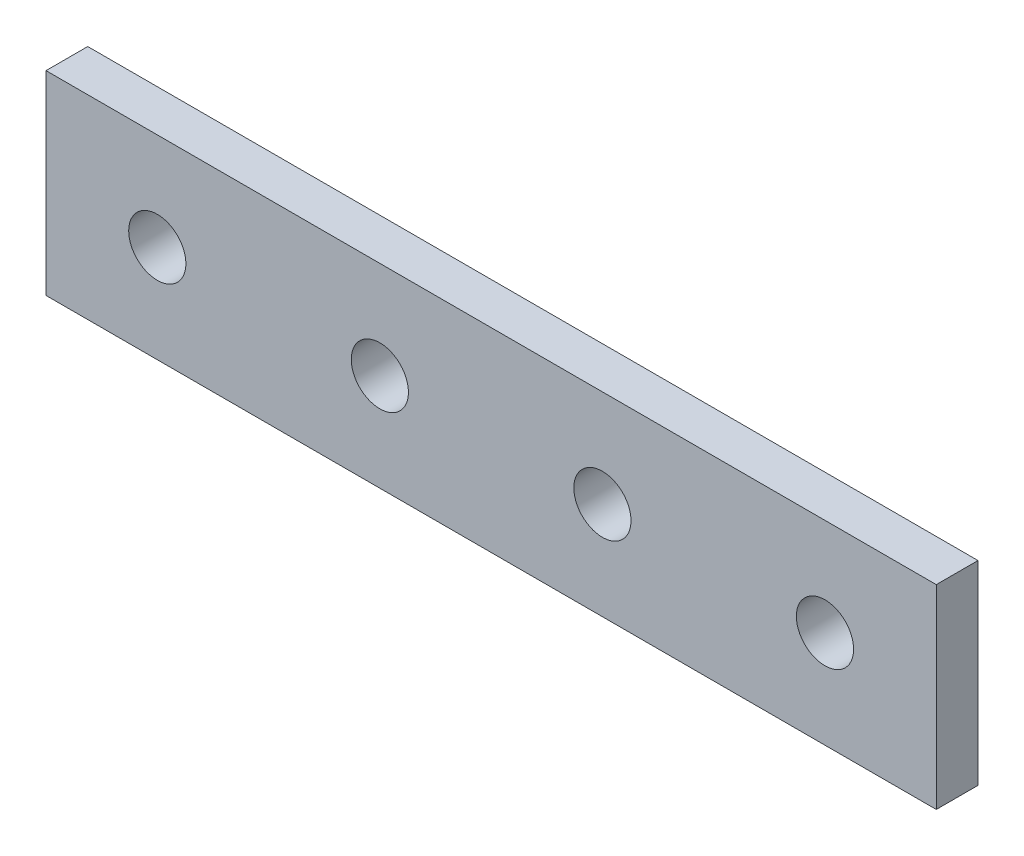
ISO-10303-21;
HEADER;
FILE_DESCRIPTION(('STEP AP214'),'2;1');
FILE_NAME('part.step','',(''),(''),'','','');
FILE_SCHEMA(('AUTOMOTIVE_DESIGN { 1 0 10303 214 1 1 1 1 }'));
ENDSEC;
DATA;
#1=APPLICATION_CONTEXT('core data for automotive mechanical design processes');
#2=APPLICATION_PROTOCOL_DEFINITION('international standard','automotive_design',2000,#1);
#3=PRODUCT_CONTEXT('',#1,'mechanical');
#4=PRODUCT('Part','Part','',(#3));
#5=PRODUCT_RELATED_PRODUCT_CATEGORY('part','',(#4));
#6=PRODUCT_DEFINITION_FORMATION('','',#4);
#7=PRODUCT_DEFINITION_CONTEXT('part definition',#1,'design');
#8=PRODUCT_DEFINITION('design','',#6,#7);
#9=PRODUCT_DEFINITION_SHAPE('','',#8);
#10=(LENGTH_UNIT() NAMED_UNIT(*) SI_UNIT(.MILLI.,.METRE.));
#11=(NAMED_UNIT(*) PLANE_ANGLE_UNIT() SI_UNIT($,.RADIAN.));
#12=(NAMED_UNIT(*) SI_UNIT($,.STERADIAN.) SOLID_ANGLE_UNIT());
#13=UNCERTAINTY_MEASURE_WITH_UNIT(LENGTH_MEASURE(1.E-05),#10,'distance_accuracy_value','');
#14=(GEOMETRIC_REPRESENTATION_CONTEXT(3) GLOBAL_UNCERTAINTY_ASSIGNED_CONTEXT((#13)) GLOBAL_UNIT_ASSIGNED_CONTEXT((#10,
#11,#12)) REPRESENTATION_CONTEXT('',''));
#15=CARTESIAN_POINT('',(0.,0.,0.));
#16=DIRECTION('',(0.,0.,1.));
#17=DIRECTION('',(1.,0.,0.));
#18=AXIS2_PLACEMENT_3D('',#15,#16,#17);
#19=CARTESIAN_POINT('',(0.,0.,2.38125));
#20=DIRECTION('',(0.,0.,-1.));
#21=DIRECTION('',(-1.,0.,0.));
#22=AXIS2_PLACEMENT_3D('',#19,#20,#21);
#23=PLANE('',#22);
#24=CARTESIAN_POINT('',(63.5,11.1125,2.38125));
#25=DIRECTION('',(0.,0.,1.));
#26=DIRECTION('',(1.,0.,0.));
#27=AXIS2_PLACEMENT_3D('',#24,#25,#26);
#28=CIRCLE('',#27,3.26389999999999);
#29=CARTESIAN_POINT('',(60.2361,11.1125,2.38125));
#30=VERTEX_POINT('',#29);
#31=EDGE_CURVE('E122',#30,#30,#28,.T.);
#32=ORIENTED_EDGE('',*,*,#31,.F.);
#33=EDGE_LOOP('',(#32));
#34=FACE_BOUND('',#33,.T.);
#35=CARTESIAN_POINT('',(12.7,11.1125,2.38125));
#36=DIRECTION('',(0.,0.,1.));
#37=DIRECTION('',(1.,0.,0.));
#38=AXIS2_PLACEMENT_3D('',#35,#36,#37);
#39=CIRCLE('',#38,3.2639);
#40=CARTESIAN_POINT('',(9.4361,11.1125,2.38125));
#41=VERTEX_POINT('',#40);
#42=EDGE_CURVE('E101',#41,#41,#39,.T.);
#43=ORIENTED_EDGE('',*,*,#42,.F.);
#44=EDGE_LOOP('',(#43));
#45=FACE_BOUND('',#44,.T.);
#46=DIRECTION('',(1.,0.,0.));
#47=VECTOR('',#46,1.);
#48=CARTESIAN_POINT('',(101.6,0.,2.38125));
#49=LINE('',#48,#47);
#50=CARTESIAN_POINT('',(0.,0.,2.38125));
#51=VERTEX_POINT('',#50);
#52=CARTESIAN_POINT('',(101.6,0.,2.38125));
#53=VERTEX_POINT('',#52);
#54=EDGE_CURVE('E86',#51,#53,#49,.T.);
#55=ORIENTED_EDGE('',*,*,#54,.T.);
#56=DIRECTION('',(0.,1.,0.));
#57=VECTOR('',#56,1.);
#58=CARTESIAN_POINT('',(101.6,22.225,2.38125));
#59=LINE('',#58,#57);
#60=CARTESIAN_POINT('',(101.6,22.225,2.38125));
#61=VERTEX_POINT('',#60);
#62=EDGE_CURVE('E81',#53,#61,#59,.T.);
#63=ORIENTED_EDGE('',*,*,#62,.T.);
#64=DIRECTION('',(-1.,0.,0.));
#65=VECTOR('',#64,1.);
#66=CARTESIAN_POINT('',(101.6,22.225,2.38125));
#67=LINE('',#66,#65);
#68=CARTESIAN_POINT('',(0.,22.225,2.38125));
#69=VERTEX_POINT('',#68);
#70=EDGE_CURVE('E84',#61,#69,#67,.T.);
#71=ORIENTED_EDGE('',*,*,#70,.T.);
#72=DIRECTION('',(0.,-1.,0.));
#73=VECTOR('',#72,1.);
#74=CARTESIAN_POINT('',(0.,0.,2.38125));
#75=LINE('',#74,#73);
#76=EDGE_CURVE('E51',#69,#51,#75,.T.);
#77=ORIENTED_EDGE('',*,*,#76,.T.);
#78=EDGE_LOOP('',(#55,#63,#71,#77));
#79=FACE_BOUND('',#78,.T.);
#80=CARTESIAN_POINT('',(38.1,11.1125,2.38125));
#81=DIRECTION('',(0.,0.,1.));
#82=DIRECTION('',(1.,0.,0.));
#83=AXIS2_PLACEMENT_3D('',#80,#81,#82);
#84=CIRCLE('',#83,3.26389999999999);
#85=CARTESIAN_POINT('',(34.8361,11.1125,2.38125));
#86=VERTEX_POINT('',#85);
#87=EDGE_CURVE('E116',#86,#86,#84,.T.);
#88=ORIENTED_EDGE('',*,*,#87,.F.);
#89=EDGE_LOOP('',(#88));
#90=FACE_BOUND('',#89,.T.);
#91=CARTESIAN_POINT('',(88.9,11.1125,2.38125));
#92=DIRECTION('',(0.,0.,1.));
#93=DIRECTION('',(1.,0.,0.));
#94=AXIS2_PLACEMENT_3D('',#91,#92,#93);
#95=CIRCLE('',#94,3.26389999999999);
#96=CARTESIAN_POINT('',(85.6361,11.1125,2.38125));
#97=VERTEX_POINT('',#96);
#98=EDGE_CURVE('E128',#97,#97,#95,.T.);
#99=ORIENTED_EDGE('',*,*,#98,.F.);
#100=EDGE_LOOP('',(#99));
#101=FACE_BOUND('',#100,.T.);
#102=ADVANCED_FACE('F34',(#34,#45,#79,#90,#101),#23,.F.);
#103=CARTESIAN_POINT('',(0.,0.,-2.38125));
#104=DIRECTION('',(0.,0.,-1.));
#105=DIRECTION('',(-1.,0.,0.));
#106=AXIS2_PLACEMENT_3D('',#103,#104,#105);
#107=PLANE('',#106);
#108=CARTESIAN_POINT('',(63.5,11.1125,-2.38125));
#109=DIRECTION('',(0.,0.,1.));
#110=DIRECTION('',(1.,0.,0.));
#111=AXIS2_PLACEMENT_3D('',#108,#109,#110);
#112=CIRCLE('',#111,3.26389999999999);
#113=CARTESIAN_POINT('',(60.2361,11.1125,-2.38125));
#114=VERTEX_POINT('',#113);
#115=EDGE_CURVE('E125',#114,#114,#112,.T.);
#116=ORIENTED_EDGE('',*,*,#115,.T.);
#117=EDGE_LOOP('',(#116));
#118=FACE_BOUND('',#117,.T.);
#119=CARTESIAN_POINT('',(12.7,11.1125,-2.38125));
#120=DIRECTION('',(0.,0.,1.));
#121=DIRECTION('',(1.,0.,0.));
#122=AXIS2_PLACEMENT_3D('',#119,#120,#121);
#123=CIRCLE('',#122,3.2639);
#124=CARTESIAN_POINT('',(9.4361,11.1125,-2.38125));
#125=VERTEX_POINT('',#124);
#126=EDGE_CURVE('E113',#125,#125,#123,.T.);
#127=ORIENTED_EDGE('',*,*,#126,.T.);
#128=EDGE_LOOP('',(#127));
#129=FACE_BOUND('',#128,.T.);
#130=DIRECTION('',(1.,0.,0.));
#131=VECTOR('',#130,1.);
#132=CARTESIAN_POINT('',(101.6,0.,-2.38125));
#133=LINE('',#132,#131);
#134=CARTESIAN_POINT('',(0.,0.,-2.38125));
#135=VERTEX_POINT('',#134);
#136=CARTESIAN_POINT('',(101.6,0.,-2.38125));
#137=VERTEX_POINT('',#136);
#138=EDGE_CURVE('E98',#135,#137,#133,.T.);
#139=ORIENTED_EDGE('',*,*,#138,.F.);
#140=DIRECTION('',(0.,-1.,0.));
#141=VECTOR('',#140,1.);
#142=CARTESIAN_POINT('',(0.,0.,-2.38125));
#143=LINE('',#142,#141);
#144=CARTESIAN_POINT('',(0.,22.225,-2.38125));
#145=VERTEX_POINT('',#144);
#146=EDGE_CURVE('E74',#145,#135,#143,.T.);
#147=ORIENTED_EDGE('',*,*,#146,.F.);
#148=DIRECTION('',(-1.,0.,0.));
#149=VECTOR('',#148,1.);
#150=CARTESIAN_POINT('',(101.6,22.225,-2.38125));
#151=LINE('',#150,#149);
#152=CARTESIAN_POINT('',(101.6,22.225,-2.38125));
#153=VERTEX_POINT('',#152);
#154=EDGE_CURVE('E68',#153,#145,#151,.T.);
#155=ORIENTED_EDGE('',*,*,#154,.F.);
#156=DIRECTION('',(0.,1.,0.));
#157=VECTOR('',#156,1.);
#158=CARTESIAN_POINT('',(101.6,22.225,-2.38125));
#159=LINE('',#158,#157);
#160=EDGE_CURVE('E90',#137,#153,#159,.T.);
#161=ORIENTED_EDGE('',*,*,#160,.F.);
#162=EDGE_LOOP('',(#139,#147,#155,#161));
#163=FACE_BOUND('',#162,.T.);
#164=CARTESIAN_POINT('',(38.1,11.1125,-2.38125));
#165=DIRECTION('',(0.,0.,1.));
#166=DIRECTION('',(1.,0.,0.));
#167=AXIS2_PLACEMENT_3D('',#164,#165,#166);
#168=CIRCLE('',#167,3.26389999999999);
#169=CARTESIAN_POINT('',(34.8361,11.1125,-2.38125));
#170=VERTEX_POINT('',#169);
#171=EDGE_CURVE('E119',#170,#170,#168,.T.);
#172=ORIENTED_EDGE('',*,*,#171,.T.);
#173=EDGE_LOOP('',(#172));
#174=FACE_BOUND('',#173,.T.);
#175=CARTESIAN_POINT('',(88.9,11.1125,-2.38125));
#176=DIRECTION('',(0.,0.,1.));
#177=DIRECTION('',(1.,0.,0.));
#178=AXIS2_PLACEMENT_3D('',#175,#176,#177);
#179=CIRCLE('',#178,3.26389999999999);
#180=CARTESIAN_POINT('',(85.6361,11.1125,-2.38125));
#181=VERTEX_POINT('',#180);
#182=EDGE_CURVE('E131',#181,#181,#179,.T.);
#183=ORIENTED_EDGE('',*,*,#182,.T.);
#184=EDGE_LOOP('',(#183));
#185=FACE_BOUND('',#184,.T.);
#186=ADVANCED_FACE('F109',(#118,#129,#163,#174,#185),#107,.T.);
#187=CARTESIAN_POINT('',(101.6,0.,2.38125));
#188=DIRECTION('',(0.,1.,0.));
#189=DIRECTION('',(-1.,0.,0.));
#190=AXIS2_PLACEMENT_3D('',#187,#188,#189);
#191=PLANE('',#190);
#192=ORIENTED_EDGE('',*,*,#138,.T.);
#193=DIRECTION('',(0.,0.,-1.));
#194=VECTOR('',#193,1.);
#195=CARTESIAN_POINT('',(101.6,0.,2.38125));
#196=LINE('',#195,#194);
#197=EDGE_CURVE('E11',#53,#137,#196,.T.);
#198=ORIENTED_EDGE('',*,*,#197,.F.);
#199=ORIENTED_EDGE('',*,*,#54,.F.);
#200=DIRECTION('',(0.,0.,-1.));
#201=VECTOR('',#200,1.);
#202=CARTESIAN_POINT('',(0.,0.,2.38125));
#203=LINE('',#202,#201);
#204=EDGE_CURVE('E94',#51,#135,#203,.T.);
#205=ORIENTED_EDGE('',*,*,#204,.T.);
#206=EDGE_LOOP('',(#192,#198,#199,#205));
#207=FACE_BOUND('',#206,.T.);
#208=ADVANCED_FACE('F36',(#207),#191,.F.);
#209=CARTESIAN_POINT('',(101.6,22.225,2.38125));
#210=DIRECTION('',(-1.,0.,0.));
#211=DIRECTION('',(0.,0.,1.));
#212=AXIS2_PLACEMENT_3D('',#209,#210,#211);
#213=PLANE('',#212);
#214=ORIENTED_EDGE('',*,*,#160,.T.);
#215=DIRECTION('',(0.,0.,-1.));
#216=VECTOR('',#215,1.);
#217=CARTESIAN_POINT('',(101.6,22.225,2.38125));
#218=LINE('',#217,#216);
#219=EDGE_CURVE('E43',#61,#153,#218,.T.);
#220=ORIENTED_EDGE('',*,*,#219,.F.);
#221=ORIENTED_EDGE('',*,*,#62,.F.);
#222=ORIENTED_EDGE('',*,*,#197,.T.);
#223=EDGE_LOOP('',(#214,#220,#221,#222));
#224=FACE_BOUND('',#223,.T.);
#225=ADVANCED_FACE('F89',(#224),#213,.F.);
#226=CARTESIAN_POINT('',(101.6,22.225,2.38125));
#227=DIRECTION('',(0.,-1.,0.));
#228=DIRECTION('',(1.,0.,0.));
#229=AXIS2_PLACEMENT_3D('',#226,#227,#228);
#230=PLANE('',#229);
#231=ORIENTED_EDGE('',*,*,#154,.T.);
#232=DIRECTION('',(0.,0.,-1.));
#233=VECTOR('',#232,1.);
#234=CARTESIAN_POINT('',(0.,22.225,2.38125));
#235=LINE('',#234,#233);
#236=EDGE_CURVE('E91',#69,#145,#235,.T.);
#237=ORIENTED_EDGE('',*,*,#236,.F.);
#238=ORIENTED_EDGE('',*,*,#70,.F.);
#239=ORIENTED_EDGE('',*,*,#219,.T.);
#240=EDGE_LOOP('',(#231,#237,#238,#239));
#241=FACE_BOUND('',#240,.T.);
#242=ADVANCED_FACE('F92',(#241),#230,.F.);
#243=CARTESIAN_POINT('',(0.,0.,2.38125));
#244=DIRECTION('',(1.,0.,0.));
#245=DIRECTION('',(0.,0.,-1.));
#246=AXIS2_PLACEMENT_3D('',#243,#244,#245);
#247=PLANE('',#246);
#248=ORIENTED_EDGE('',*,*,#146,.T.);
#249=ORIENTED_EDGE('',*,*,#204,.F.);
#250=ORIENTED_EDGE('',*,*,#76,.F.);
#251=ORIENTED_EDGE('',*,*,#236,.T.);
#252=EDGE_LOOP('',(#248,#249,#250,#251));
#253=FACE_BOUND('',#252,.T.);
#254=ADVANCED_FACE('F106',(#253),#247,.F.);
#255=CARTESIAN_POINT('',(12.7,11.1125,2.38125));
#256=DIRECTION('',(0.,0.,-1.));
#257=DIRECTION('',(-1.,0.,0.));
#258=AXIS2_PLACEMENT_3D('',#255,#256,#257);
#259=CYLINDRICAL_SURFACE('',#258,3.2639);
#260=CARTESIAN_POINT('',(9.4361,11.1125,2.38125));
#261=CARTESIAN_POINT('',(9.4361,11.1125,2.331640625));
#262=CARTESIAN_POINT('',(9.4361,11.1125,2.28203125));
#263=CARTESIAN_POINT('',(9.4361,11.1125,2.1828125));
#264=CARTESIAN_POINT('',(9.4361,11.1125,2.133203125));
#265=CARTESIAN_POINT('',(9.4361,11.1125,2.033984375));
#266=CARTESIAN_POINT('',(9.4361,11.1125,1.984375));
#267=CARTESIAN_POINT('',(9.4361,11.1125,1.88515625));
#268=CARTESIAN_POINT('',(9.4361,11.1125,1.835546875));
#269=CARTESIAN_POINT('',(9.4361,11.1125,1.736328125));
#270=CARTESIAN_POINT('',(9.4361,11.1125,1.68671875));
#271=CARTESIAN_POINT('',(9.4361,11.1125,1.5875));
#272=CARTESIAN_POINT('',(9.4361,11.1125,1.537890625));
#273=CARTESIAN_POINT('',(9.4361,11.1125,1.438671875));
#274=CARTESIAN_POINT('',(9.4361,11.1125,1.3890625));
#275=CARTESIAN_POINT('',(9.4361,11.1125,1.28984375));
#276=CARTESIAN_POINT('',(9.4361,11.1125,1.240234375));
#277=CARTESIAN_POINT('',(9.4361,11.1125,1.141015625));
#278=CARTESIAN_POINT('',(9.4361,11.1125,1.09140625));
#279=CARTESIAN_POINT('',(9.4361,11.1125,0.9921875));
#280=CARTESIAN_POINT('',(9.4361,11.1125,0.942578125));
#281=CARTESIAN_POINT('',(9.4361,11.1125,0.843359375));
#282=CARTESIAN_POINT('',(9.4361,11.1125,0.79375));
#283=CARTESIAN_POINT('',(9.4361,11.1125,0.69453125));
#284=CARTESIAN_POINT('',(9.4361,11.1125,0.644921875));
#285=CARTESIAN_POINT('',(9.4361,11.1125,0.545703125));
#286=CARTESIAN_POINT('',(9.4361,11.1125,0.49609375));
#287=CARTESIAN_POINT('',(9.4361,11.1125,0.396875));
#288=CARTESIAN_POINT('',(9.4361,11.1125,0.347265625));
#289=CARTESIAN_POINT('',(9.4361,11.1125,0.248046875));
#290=CARTESIAN_POINT('',(9.4361,11.1125,0.1984375));
#291=CARTESIAN_POINT('',(9.4361,11.1125,0.0992187499999996));
#292=CARTESIAN_POINT('',(9.4361,11.1125,0.0496093749999996));
#293=CARTESIAN_POINT('',(9.4361,11.1125,-0.0496093750000005));
#294=CARTESIAN_POINT('',(9.4361,11.1125,-0.0992187500000005));
#295=CARTESIAN_POINT('',(9.4361,11.1125,-0.198437500000001));
#296=CARTESIAN_POINT('',(9.4361,11.1125,-0.248046875000001));
#297=CARTESIAN_POINT('',(9.4361,11.1125,-0.347265625000001));
#298=CARTESIAN_POINT('',(9.4361,11.1125,-0.396875000000001));
#299=CARTESIAN_POINT('',(9.4361,11.1125,-0.496093750000001));
#300=CARTESIAN_POINT('',(9.4361,11.1125,-0.545703125000001));
#301=CARTESIAN_POINT('',(9.4361,11.1125,-0.644921875000001));
#302=CARTESIAN_POINT('',(9.4361,11.1125,-0.694531250000001));
#303=CARTESIAN_POINT('',(9.4361,11.1125,-0.793750000000001));
#304=CARTESIAN_POINT('',(9.4361,11.1125,-0.843359375));
#305=CARTESIAN_POINT('',(9.4361,11.1125,-0.942578125000001));
#306=CARTESIAN_POINT('',(9.4361,11.1125,-0.992187500000001));
#307=CARTESIAN_POINT('',(9.4361,11.1125,-1.09140625));
#308=CARTESIAN_POINT('',(9.4361,11.1125,-1.141015625));
#309=CARTESIAN_POINT('',(9.4361,11.1125,-1.240234375));
#310=CARTESIAN_POINT('',(9.4361,11.1125,-1.28984375));
#311=CARTESIAN_POINT('',(9.4361,11.1125,-1.3890625));
#312=CARTESIAN_POINT('',(9.4361,11.1125,-1.438671875));
#313=CARTESIAN_POINT('',(9.4361,11.1125,-1.537890625));
#314=CARTESIAN_POINT('',(9.4361,11.1125,-1.5875));
#315=CARTESIAN_POINT('',(9.4361,11.1125,-1.68671875));
#316=CARTESIAN_POINT('',(9.4361,11.1125,-1.736328125));
#317=CARTESIAN_POINT('',(9.4361,11.1125,-1.835546875));
#318=CARTESIAN_POINT('',(9.4361,11.1125,-1.88515625));
#319=CARTESIAN_POINT('',(9.4361,11.1125,-1.984375));
#320=CARTESIAN_POINT('',(9.4361,11.1125,-2.033984375));
#321=CARTESIAN_POINT('',(9.4361,11.1125,-2.133203125));
#322=CARTESIAN_POINT('',(9.4361,11.1125,-2.1828125));
#323=CARTESIAN_POINT('',(9.4361,11.1125,-2.28203125));
#324=CARTESIAN_POINT('',(9.4361,11.1125,-2.331640625));
#325=CARTESIAN_POINT('',(9.4361,11.1125,-2.38125));
#326=B_SPLINE_CURVE_WITH_KNOTS('',3,(#260,#261,#262,#263,#264,#265,#266,#267,#268,#269,#270,
#271,#272,#273,#274,#275,#276,#277,#278,#279,#280,#281,#282,#283,#284,#285,#286,#287,#288,#289,
#290,#291,#292,#293,#294,#295,#296,#297,#298,#299,#300,#301,#302,#303,#304,#305,#306,#307,#308,
#309,#310,#311,#312,#313,#314,#315,#316,#317,#318,#319,#320,#321,#322,#323,#324,#325),
.UNSPECIFIED.,.F.,.F.,(4,2,2,2,2,2,2,2,2,2,2,2,2,2,2,2,2,2,2,2,2,2,2,2,2,2,2,2,2,2,2,2,4),(0.,
0.148828125,0.29765625,0.446484375,0.5953125,0.744140625,0.89296875,1.041796875,1.190625,
1.339453125,1.48828125,1.637109375,1.7859375,1.934765625,2.08359375,2.232421875,2.38125,
2.530078125,2.67890625,2.827734375,2.9765625,3.125390625,3.27421875,3.423046875,3.571875,
3.720703125,3.86953125,4.018359375,4.1671875,4.316015625,4.46484375,4.613671875,4.7625),.UNSPECIFIED.);
#327=EDGE_CURVE('BSEAM151',#41,#125,#326,.T.);
#328=ORIENTED_EDGE('',*,*,#42,.T.);
#329=ORIENTED_EDGE('',*,*,#126,.F.);
#330=ORIENTED_EDGE('',*,*,#327,.T.);
#331=ORIENTED_EDGE('',*,*,#327,.F.);
#332=EDGE_LOOP('',(#328,#330,#329,#331));
#333=FACE_BOUND('',#332,.T.);
#334=ADVANCED_FACE('F151',(#333),#259,.F.);
#335=CARTESIAN_POINT('',(38.1,11.1125,2.38125));
#336=DIRECTION('',(0.,0.,-1.));
#337=DIRECTION('',(-1.,0.,0.));
#338=AXIS2_PLACEMENT_3D('',#335,#336,#337);
#339=CYLINDRICAL_SURFACE('',#338,3.26389999999999);
#340=CARTESIAN_POINT('',(34.8361,11.1125,2.38125));
#341=CARTESIAN_POINT('',(34.8361,11.1125,2.331640625));
#342=CARTESIAN_POINT('',(34.8361,11.1125,2.28203125));
#343=CARTESIAN_POINT('',(34.8361,11.1125,2.1828125));
#344=CARTESIAN_POINT('',(34.8361,11.1125,2.133203125));
#345=CARTESIAN_POINT('',(34.8361,11.1125,2.033984375));
#346=CARTESIAN_POINT('',(34.8361,11.1125,1.984375));
#347=CARTESIAN_POINT('',(34.8361,11.1125,1.88515625));
#348=CARTESIAN_POINT('',(34.8361,11.1125,1.835546875));
#349=CARTESIAN_POINT('',(34.8361,11.1125,1.736328125));
#350=CARTESIAN_POINT('',(34.8361,11.1125,1.68671875));
#351=CARTESIAN_POINT('',(34.8361,11.1125,1.5875));
#352=CARTESIAN_POINT('',(34.8361,11.1125,1.537890625));
#353=CARTESIAN_POINT('',(34.8361,11.1125,1.438671875));
#354=CARTESIAN_POINT('',(34.8361,11.1125,1.3890625));
#355=CARTESIAN_POINT('',(34.8361,11.1125,1.28984375));
#356=CARTESIAN_POINT('',(34.8361,11.1125,1.240234375));
#357=CARTESIAN_POINT('',(34.8361,11.1125,1.141015625));
#358=CARTESIAN_POINT('',(34.8361,11.1125,1.09140625));
#359=CARTESIAN_POINT('',(34.8361,11.1125,0.9921875));
#360=CARTESIAN_POINT('',(34.8361,11.1125,0.942578125));
#361=CARTESIAN_POINT('',(34.8361,11.1125,0.843359375));
#362=CARTESIAN_POINT('',(34.8361,11.1125,0.79375));
#363=CARTESIAN_POINT('',(34.8361,11.1125,0.69453125));
#364=CARTESIAN_POINT('',(34.8361,11.1125,0.644921875));
#365=CARTESIAN_POINT('',(34.8361,11.1125,0.545703125));
#366=CARTESIAN_POINT('',(34.8361,11.1125,0.49609375));
#367=CARTESIAN_POINT('',(34.8361,11.1125,0.396875));
#368=CARTESIAN_POINT('',(34.8361,11.1125,0.347265625));
#369=CARTESIAN_POINT('',(34.8361,11.1125,0.248046875));
#370=CARTESIAN_POINT('',(34.8361,11.1125,0.1984375));
#371=CARTESIAN_POINT('',(34.8361,11.1125,0.0992187499999996));
#372=CARTESIAN_POINT('',(34.8361,11.1125,0.0496093749999996));
#373=CARTESIAN_POINT('',(34.8361,11.1125,-0.0496093750000005));
#374=CARTESIAN_POINT('',(34.8361,11.1125,-0.0992187500000005));
#375=CARTESIAN_POINT('',(34.8361,11.1125,-0.198437500000001));
#376=CARTESIAN_POINT('',(34.8361,11.1125,-0.248046875000001));
#377=CARTESIAN_POINT('',(34.8361,11.1125,-0.347265625000001));
#378=CARTESIAN_POINT('',(34.8361,11.1125,-0.396875000000001));
#379=CARTESIAN_POINT('',(34.8361,11.1125,-0.496093750000001));
#380=CARTESIAN_POINT('',(34.8361,11.1125,-0.545703125000001));
#381=CARTESIAN_POINT('',(34.8361,11.1125,-0.644921875000001));
#382=CARTESIAN_POINT('',(34.8361,11.1125,-0.694531250000001));
#383=CARTESIAN_POINT('',(34.8361,11.1125,-0.793750000000001));
#384=CARTESIAN_POINT('',(34.8361,11.1125,-0.843359375));
#385=CARTESIAN_POINT('',(34.8361,11.1125,-0.942578125000001));
#386=CARTESIAN_POINT('',(34.8361,11.1125,-0.992187500000001));
#387=CARTESIAN_POINT('',(34.8361,11.1125,-1.09140625));
#388=CARTESIAN_POINT('',(34.8361,11.1125,-1.141015625));
#389=CARTESIAN_POINT('',(34.8361,11.1125,-1.240234375));
#390=CARTESIAN_POINT('',(34.8361,11.1125,-1.28984375));
#391=CARTESIAN_POINT('',(34.8361,11.1125,-1.3890625));
#392=CARTESIAN_POINT('',(34.8361,11.1125,-1.438671875));
#393=CARTESIAN_POINT('',(34.8361,11.1125,-1.537890625));
#394=CARTESIAN_POINT('',(34.8361,11.1125,-1.5875));
#395=CARTESIAN_POINT('',(34.8361,11.1125,-1.68671875));
#396=CARTESIAN_POINT('',(34.8361,11.1125,-1.736328125));
#397=CARTESIAN_POINT('',(34.8361,11.1125,-1.835546875));
#398=CARTESIAN_POINT('',(34.8361,11.1125,-1.88515625));
#399=CARTESIAN_POINT('',(34.8361,11.1125,-1.984375));
#400=CARTESIAN_POINT('',(34.8361,11.1125,-2.033984375));
#401=CARTESIAN_POINT('',(34.8361,11.1125,-2.133203125));
#402=CARTESIAN_POINT('',(34.8361,11.1125,-2.1828125));
#403=CARTESIAN_POINT('',(34.8361,11.1125,-2.28203125));
#404=CARTESIAN_POINT('',(34.8361,11.1125,-2.331640625));
#405=CARTESIAN_POINT('',(34.8361,11.1125,-2.38125));
#406=B_SPLINE_CURVE_WITH_KNOTS('',3,(#340,#341,#342,#343,#344,#345,#346,#347,#348,#349,#350,
#351,#352,#353,#354,#355,#356,#357,#358,#359,#360,#361,#362,#363,#364,#365,#366,#367,#368,#369,
#370,#371,#372,#373,#374,#375,#376,#377,#378,#379,#380,#381,#382,#383,#384,#385,#386,#387,#388,
#389,#390,#391,#392,#393,#394,#395,#396,#397,#398,#399,#400,#401,#402,#403,#404,#405),
.UNSPECIFIED.,.F.,.F.,(4,2,2,2,2,2,2,2,2,2,2,2,2,2,2,2,2,2,2,2,2,2,2,2,2,2,2,2,2,2,2,2,4),(0.,
0.148828125,0.29765625,0.446484375,0.5953125,0.744140625,0.89296875,1.041796875,1.190625,
1.339453125,1.48828125,1.637109375,1.7859375,1.934765625,2.08359375,2.232421875,2.38125,
2.530078125,2.67890625,2.827734375,2.9765625,3.125390625,3.27421875,3.423046875,3.571875,
3.720703125,3.86953125,4.018359375,4.1671875,4.316015625,4.46484375,4.613671875,4.7625),.UNSPECIFIED.);
#407=EDGE_CURVE('BSEAM197',#86,#170,#406,.T.);
#408=ORIENTED_EDGE('',*,*,#87,.T.);
#409=ORIENTED_EDGE('',*,*,#171,.F.);
#410=ORIENTED_EDGE('',*,*,#407,.T.);
#411=ORIENTED_EDGE('',*,*,#407,.F.);
#412=EDGE_LOOP('',(#408,#410,#409,#411));
#413=FACE_BOUND('',#412,.T.);
#414=ADVANCED_FACE('F197',(#413),#339,.F.);
#415=CARTESIAN_POINT('',(63.5,11.1125,2.38125));
#416=DIRECTION('',(0.,0.,-1.));
#417=DIRECTION('',(-1.,0.,0.));
#418=AXIS2_PLACEMENT_3D('',#415,#416,#417);
#419=CYLINDRICAL_SURFACE('',#418,3.26389999999999);
#420=CARTESIAN_POINT('',(60.2361,11.1125,2.38125));
#421=CARTESIAN_POINT('',(60.2361,11.1125,2.331640625));
#422=CARTESIAN_POINT('',(60.2361,11.1125,2.28203125));
#423=CARTESIAN_POINT('',(60.2361,11.1125,2.1828125));
#424=CARTESIAN_POINT('',(60.2361,11.1125,2.133203125));
#425=CARTESIAN_POINT('',(60.2361,11.1125,2.033984375));
#426=CARTESIAN_POINT('',(60.2361,11.1125,1.984375));
#427=CARTESIAN_POINT('',(60.2361,11.1125,1.88515625));
#428=CARTESIAN_POINT('',(60.2361,11.1125,1.835546875));
#429=CARTESIAN_POINT('',(60.2361,11.1125,1.736328125));
#430=CARTESIAN_POINT('',(60.2361,11.1125,1.68671875));
#431=CARTESIAN_POINT('',(60.2361,11.1125,1.5875));
#432=CARTESIAN_POINT('',(60.2361,11.1125,1.537890625));
#433=CARTESIAN_POINT('',(60.2361,11.1125,1.438671875));
#434=CARTESIAN_POINT('',(60.2361,11.1125,1.3890625));
#435=CARTESIAN_POINT('',(60.2361,11.1125,1.28984375));
#436=CARTESIAN_POINT('',(60.2361,11.1125,1.240234375));
#437=CARTESIAN_POINT('',(60.2361,11.1125,1.141015625));
#438=CARTESIAN_POINT('',(60.2361,11.1125,1.09140625));
#439=CARTESIAN_POINT('',(60.2361,11.1125,0.9921875));
#440=CARTESIAN_POINT('',(60.2361,11.1125,0.942578125));
#441=CARTESIAN_POINT('',(60.2361,11.1125,0.843359375));
#442=CARTESIAN_POINT('',(60.2361,11.1125,0.79375));
#443=CARTESIAN_POINT('',(60.2361,11.1125,0.69453125));
#444=CARTESIAN_POINT('',(60.2361,11.1125,0.644921875));
#445=CARTESIAN_POINT('',(60.2361,11.1125,0.545703125));
#446=CARTESIAN_POINT('',(60.2361,11.1125,0.49609375));
#447=CARTESIAN_POINT('',(60.2361,11.1125,0.396875));
#448=CARTESIAN_POINT('',(60.2361,11.1125,0.347265625));
#449=CARTESIAN_POINT('',(60.2361,11.1125,0.248046875));
#450=CARTESIAN_POINT('',(60.2361,11.1125,0.1984375));
#451=CARTESIAN_POINT('',(60.2361,11.1125,0.0992187499999996));
#452=CARTESIAN_POINT('',(60.2361,11.1125,0.0496093749999996));
#453=CARTESIAN_POINT('',(60.2361,11.1125,-0.0496093750000005));
#454=CARTESIAN_POINT('',(60.2361,11.1125,-0.0992187500000005));
#455=CARTESIAN_POINT('',(60.2361,11.1125,-0.198437500000001));
#456=CARTESIAN_POINT('',(60.2361,11.1125,-0.248046875000001));
#457=CARTESIAN_POINT('',(60.2361,11.1125,-0.347265625000001));
#458=CARTESIAN_POINT('',(60.2361,11.1125,-0.396875000000001));
#459=CARTESIAN_POINT('',(60.2361,11.1125,-0.496093750000001));
#460=CARTESIAN_POINT('',(60.2361,11.1125,-0.545703125000001));
#461=CARTESIAN_POINT('',(60.2361,11.1125,-0.644921875000001));
#462=CARTESIAN_POINT('',(60.2361,11.1125,-0.694531250000001));
#463=CARTESIAN_POINT('',(60.2361,11.1125,-0.793750000000001));
#464=CARTESIAN_POINT('',(60.2361,11.1125,-0.843359375));
#465=CARTESIAN_POINT('',(60.2361,11.1125,-0.942578125000001));
#466=CARTESIAN_POINT('',(60.2361,11.1125,-0.992187500000001));
#467=CARTESIAN_POINT('',(60.2361,11.1125,-1.09140625));
#468=CARTESIAN_POINT('',(60.2361,11.1125,-1.141015625));
#469=CARTESIAN_POINT('',(60.2361,11.1125,-1.240234375));
#470=CARTESIAN_POINT('',(60.2361,11.1125,-1.28984375));
#471=CARTESIAN_POINT('',(60.2361,11.1125,-1.3890625));
#472=CARTESIAN_POINT('',(60.2361,11.1125,-1.438671875));
#473=CARTESIAN_POINT('',(60.2361,11.1125,-1.537890625));
#474=CARTESIAN_POINT('',(60.2361,11.1125,-1.5875));
#475=CARTESIAN_POINT('',(60.2361,11.1125,-1.68671875));
#476=CARTESIAN_POINT('',(60.2361,11.1125,-1.736328125));
#477=CARTESIAN_POINT('',(60.2361,11.1125,-1.835546875));
#478=CARTESIAN_POINT('',(60.2361,11.1125,-1.88515625));
#479=CARTESIAN_POINT('',(60.2361,11.1125,-1.984375));
#480=CARTESIAN_POINT('',(60.2361,11.1125,-2.033984375));
#481=CARTESIAN_POINT('',(60.2361,11.1125,-2.133203125));
#482=CARTESIAN_POINT('',(60.2361,11.1125,-2.1828125));
#483=CARTESIAN_POINT('',(60.2361,11.1125,-2.28203125));
#484=CARTESIAN_POINT('',(60.2361,11.1125,-2.331640625));
#485=CARTESIAN_POINT('',(60.2361,11.1125,-2.38125));
#486=B_SPLINE_CURVE_WITH_KNOTS('',3,(#420,#421,#422,#423,#424,#425,#426,#427,#428,#429,#430,
#431,#432,#433,#434,#435,#436,#437,#438,#439,#440,#441,#442,#443,#444,#445,#446,#447,#448,#449,
#450,#451,#452,#453,#454,#455,#456,#457,#458,#459,#460,#461,#462,#463,#464,#465,#466,#467,#468,
#469,#470,#471,#472,#473,#474,#475,#476,#477,#478,#479,#480,#481,#482,#483,#484,#485),
.UNSPECIFIED.,.F.,.F.,(4,2,2,2,2,2,2,2,2,2,2,2,2,2,2,2,2,2,2,2,2,2,2,2,2,2,2,2,2,2,2,2,4),(0.,
0.148828125,0.29765625,0.446484375,0.5953125,0.744140625,0.89296875,1.041796875,1.190625,
1.339453125,1.48828125,1.637109375,1.7859375,1.934765625,2.08359375,2.232421875,2.38125,
2.530078125,2.67890625,2.827734375,2.9765625,3.125390625,3.27421875,3.423046875,3.571875,
3.720703125,3.86953125,4.018359375,4.1671875,4.316015625,4.46484375,4.613671875,4.7625),.UNSPECIFIED.);
#487=EDGE_CURVE('BSEAM205',#30,#114,#486,.T.);
#488=ORIENTED_EDGE('',*,*,#31,.T.);
#489=ORIENTED_EDGE('',*,*,#115,.F.);
#490=ORIENTED_EDGE('',*,*,#487,.T.);
#491=ORIENTED_EDGE('',*,*,#487,.F.);
#492=EDGE_LOOP('',(#488,#490,#489,#491));
#493=FACE_BOUND('',#492,.T.);
#494=ADVANCED_FACE('F205',(#493),#419,.F.);
#495=CARTESIAN_POINT('',(88.9,11.1125,2.38125));
#496=DIRECTION('',(0.,0.,-1.));
#497=DIRECTION('',(-1.,0.,0.));
#498=AXIS2_PLACEMENT_3D('',#495,#496,#497);
#499=CYLINDRICAL_SURFACE('',#498,3.26389999999999);
#500=CARTESIAN_POINT('',(85.6361,11.1125,2.38125));
#501=CARTESIAN_POINT('',(85.6361,11.1125,2.331640625));
#502=CARTESIAN_POINT('',(85.6361,11.1125,2.28203125));
#503=CARTESIAN_POINT('',(85.6361,11.1125,2.1828125));
#504=CARTESIAN_POINT('',(85.6361,11.1125,2.133203125));
#505=CARTESIAN_POINT('',(85.6361,11.1125,2.033984375));
#506=CARTESIAN_POINT('',(85.6361,11.1125,1.984375));
#507=CARTESIAN_POINT('',(85.6361,11.1125,1.88515625));
#508=CARTESIAN_POINT('',(85.6361,11.1125,1.835546875));
#509=CARTESIAN_POINT('',(85.6361,11.1125,1.736328125));
#510=CARTESIAN_POINT('',(85.6361,11.1125,1.68671875));
#511=CARTESIAN_POINT('',(85.6361,11.1125,1.5875));
#512=CARTESIAN_POINT('',(85.6361,11.1125,1.537890625));
#513=CARTESIAN_POINT('',(85.6361,11.1125,1.438671875));
#514=CARTESIAN_POINT('',(85.6361,11.1125,1.3890625));
#515=CARTESIAN_POINT('',(85.6361,11.1125,1.28984375));
#516=CARTESIAN_POINT('',(85.6361,11.1125,1.240234375));
#517=CARTESIAN_POINT('',(85.6361,11.1125,1.141015625));
#518=CARTESIAN_POINT('',(85.6361,11.1125,1.09140625));
#519=CARTESIAN_POINT('',(85.6361,11.1125,0.9921875));
#520=CARTESIAN_POINT('',(85.6361,11.1125,0.942578125));
#521=CARTESIAN_POINT('',(85.6361,11.1125,0.843359375));
#522=CARTESIAN_POINT('',(85.6361,11.1125,0.79375));
#523=CARTESIAN_POINT('',(85.6361,11.1125,0.69453125));
#524=CARTESIAN_POINT('',(85.6361,11.1125,0.644921875));
#525=CARTESIAN_POINT('',(85.6361,11.1125,0.545703125));
#526=CARTESIAN_POINT('',(85.6361,11.1125,0.49609375));
#527=CARTESIAN_POINT('',(85.6361,11.1125,0.396875));
#528=CARTESIAN_POINT('',(85.6361,11.1125,0.347265625));
#529=CARTESIAN_POINT('',(85.6361,11.1125,0.248046875));
#530=CARTESIAN_POINT('',(85.6361,11.1125,0.1984375));
#531=CARTESIAN_POINT('',(85.6361,11.1125,0.0992187499999996));
#532=CARTESIAN_POINT('',(85.6361,11.1125,0.0496093749999996));
#533=CARTESIAN_POINT('',(85.6361,11.1125,-0.0496093750000005));
#534=CARTESIAN_POINT('',(85.6361,11.1125,-0.0992187500000005));
#535=CARTESIAN_POINT('',(85.6361,11.1125,-0.198437500000001));
#536=CARTESIAN_POINT('',(85.6361,11.1125,-0.248046875000001));
#537=CARTESIAN_POINT('',(85.6361,11.1125,-0.347265625000001));
#538=CARTESIAN_POINT('',(85.6361,11.1125,-0.396875000000001));
#539=CARTESIAN_POINT('',(85.6361,11.1125,-0.496093750000001));
#540=CARTESIAN_POINT('',(85.6361,11.1125,-0.545703125000001));
#541=CARTESIAN_POINT('',(85.6361,11.1125,-0.644921875000001));
#542=CARTESIAN_POINT('',(85.6361,11.1125,-0.694531250000001));
#543=CARTESIAN_POINT('',(85.6361,11.1125,-0.793750000000001));
#544=CARTESIAN_POINT('',(85.6361,11.1125,-0.843359375));
#545=CARTESIAN_POINT('',(85.6361,11.1125,-0.942578125000001));
#546=CARTESIAN_POINT('',(85.6361,11.1125,-0.992187500000001));
#547=CARTESIAN_POINT('',(85.6361,11.1125,-1.09140625));
#548=CARTESIAN_POINT('',(85.6361,11.1125,-1.141015625));
#549=CARTESIAN_POINT('',(85.6361,11.1125,-1.240234375));
#550=CARTESIAN_POINT('',(85.6361,11.1125,-1.28984375));
#551=CARTESIAN_POINT('',(85.6361,11.1125,-1.3890625));
#552=CARTESIAN_POINT('',(85.6361,11.1125,-1.438671875));
#553=CARTESIAN_POINT('',(85.6361,11.1125,-1.537890625));
#554=CARTESIAN_POINT('',(85.6361,11.1125,-1.5875));
#555=CARTESIAN_POINT('',(85.6361,11.1125,-1.68671875));
#556=CARTESIAN_POINT('',(85.6361,11.1125,-1.736328125));
#557=CARTESIAN_POINT('',(85.6361,11.1125,-1.835546875));
#558=CARTESIAN_POINT('',(85.6361,11.1125,-1.88515625));
#559=CARTESIAN_POINT('',(85.6361,11.1125,-1.984375));
#560=CARTESIAN_POINT('',(85.6361,11.1125,-2.033984375));
#561=CARTESIAN_POINT('',(85.6361,11.1125,-2.133203125));
#562=CARTESIAN_POINT('',(85.6361,11.1125,-2.1828125));
#563=CARTESIAN_POINT('',(85.6361,11.1125,-2.28203125));
#564=CARTESIAN_POINT('',(85.6361,11.1125,-2.331640625));
#565=CARTESIAN_POINT('',(85.6361,11.1125,-2.38125));
#566=B_SPLINE_CURVE_WITH_KNOTS('',3,(#500,#501,#502,#503,#504,#505,#506,#507,#508,#509,#510,
#511,#512,#513,#514,#515,#516,#517,#518,#519,#520,#521,#522,#523,#524,#525,#526,#527,#528,#529,
#530,#531,#532,#533,#534,#535,#536,#537,#538,#539,#540,#541,#542,#543,#544,#545,#546,#547,#548,
#549,#550,#551,#552,#553,#554,#555,#556,#557,#558,#559,#560,#561,#562,#563,#564,#565),
.UNSPECIFIED.,.F.,.F.,(4,2,2,2,2,2,2,2,2,2,2,2,2,2,2,2,2,2,2,2,2,2,2,2,2,2,2,2,2,2,2,2,4),(0.,
0.148828125,0.29765625,0.446484375,0.5953125,0.744140625,0.89296875,1.041796875,1.190625,
1.339453125,1.48828125,1.637109375,1.7859375,1.934765625,2.08359375,2.232421875,2.38125,
2.530078125,2.67890625,2.827734375,2.9765625,3.125390625,3.27421875,3.423046875,3.571875,
3.720703125,3.86953125,4.018359375,4.1671875,4.316015625,4.46484375,4.613671875,4.7625),.UNSPECIFIED.);
#567=EDGE_CURVE('BSEAM137',#97,#181,#566,.T.);
#568=ORIENTED_EDGE('',*,*,#98,.T.);
#569=ORIENTED_EDGE('',*,*,#182,.F.);
#570=ORIENTED_EDGE('',*,*,#567,.T.);
#571=ORIENTED_EDGE('',*,*,#567,.F.);
#572=EDGE_LOOP('',(#568,#570,#569,#571));
#573=FACE_BOUND('',#572,.T.);
#574=ADVANCED_FACE('F137',(#573),#499,.F.);
#575=CLOSED_SHELL('',(#102,#186,#208,#225,#242,#254,#334,#414,#494,#574));
#576=MANIFOLD_SOLID_BREP('B2',#575);
#577=ADVANCED_BREP_SHAPE_REPRESENTATION('',(#18,#576),#14);
#578=SHAPE_DEFINITION_REPRESENTATION(#9,#577);
ENDSEC;
END-ISO-10303-21;
